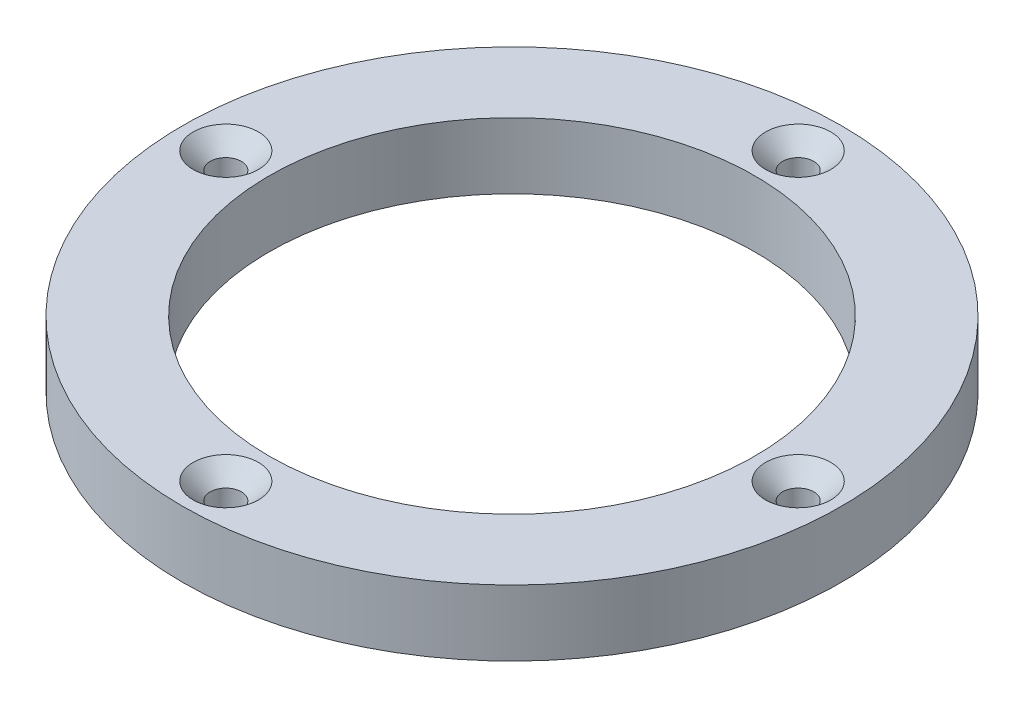
ISO-10303-21;
HEADER;
FILE_DESCRIPTION(('STEP AP214'),'2;1');
FILE_NAME('part.step','',(''),(''),'','','');
FILE_SCHEMA(('AUTOMOTIVE_DESIGN { 1 0 10303 214 1 1 1 1 }'));
ENDSEC;
DATA;
#1=APPLICATION_CONTEXT('core data for automotive mechanical design processes');
#2=APPLICATION_PROTOCOL_DEFINITION('international standard','automotive_design',2000,#1);
#3=PRODUCT_CONTEXT('',#1,'mechanical');
#4=PRODUCT('Part','Part','',(#3));
#5=PRODUCT_RELATED_PRODUCT_CATEGORY('part','',(#4));
#6=PRODUCT_DEFINITION_FORMATION('','',#4);
#7=PRODUCT_DEFINITION_CONTEXT('part definition',#1,'design');
#8=PRODUCT_DEFINITION('design','',#6,#7);
#9=PRODUCT_DEFINITION_SHAPE('','',#8);
#10=(LENGTH_UNIT() NAMED_UNIT(*) SI_UNIT(.MILLI.,.METRE.));
#11=(NAMED_UNIT(*) PLANE_ANGLE_UNIT() SI_UNIT($,.RADIAN.));
#12=(NAMED_UNIT(*) SI_UNIT($,.STERADIAN.) SOLID_ANGLE_UNIT());
#13=UNCERTAINTY_MEASURE_WITH_UNIT(LENGTH_MEASURE(1.E-05),#10,'distance_accuracy_value','');
#14=(GEOMETRIC_REPRESENTATION_CONTEXT(3) GLOBAL_UNCERTAINTY_ASSIGNED_CONTEXT((#13)) GLOBAL_UNIT_ASSIGNED_CONTEXT((#10,
#11,#12)) REPRESENTATION_CONTEXT('',''));
#15=CARTESIAN_POINT('',(0.,0.,0.));
#16=DIRECTION('',(0.,0.,1.));
#17=DIRECTION('',(1.,0.,0.));
#18=AXIS2_PLACEMENT_3D('',#15,#16,#17);
#19=CARTESIAN_POINT('',(0.,9.5,0.));
#20=DIRECTION('',(0.,1.,0.));
#21=DIRECTION('',(0.,0.,1.));
#22=AXIS2_PLACEMENT_3D('',#19,#20,#21);
#23=PLANE('',#22);
#24=CARTESIAN_POINT('',(0.,9.5,41.25));
#25=DIRECTION('',(0.,1.,0.));
#26=DIRECTION('',(0.,0.,1.));
#27=AXIS2_PLACEMENT_3D('',#24,#25,#26);
#28=CIRCLE('',#27,4.7);
#29=CARTESIAN_POINT('',(0.,9.5,45.95));
#30=VERTEX_POINT('',#29);
#31=EDGE_CURVE('E117',#30,#30,#28,.T.);
#32=ORIENTED_EDGE('',*,*,#31,.F.);
#33=EDGE_LOOP('',(#32));
#34=FACE_BOUND('',#33,.T.);
#35=CARTESIAN_POINT('',(41.25,9.5,0.));
#36=DIRECTION('',(0.,1.,0.));
#37=DIRECTION('',(0.,0.,1.));
#38=AXIS2_PLACEMENT_3D('',#35,#36,#37);
#39=CIRCLE('',#38,4.7);
#40=CARTESIAN_POINT('',(41.25,9.5,4.7));
#41=VERTEX_POINT('',#40);
#42=EDGE_CURVE('E109',#41,#41,#39,.T.);
#43=ORIENTED_EDGE('',*,*,#42,.F.);
#44=EDGE_LOOP('',(#43));
#45=FACE_BOUND('',#44,.T.);
#46=CARTESIAN_POINT('',(0.,9.5,-41.25));
#47=DIRECTION('',(0.,1.,0.));
#48=DIRECTION('',(0.,0.,1.));
#49=AXIS2_PLACEMENT_3D('',#46,#47,#48);
#50=CIRCLE('',#49,4.7);
#51=CARTESIAN_POINT('',(0.,9.5,-36.55));
#52=VERTEX_POINT('',#51);
#53=EDGE_CURVE('E101',#52,#52,#50,.T.);
#54=ORIENTED_EDGE('',*,*,#53,.F.);
#55=EDGE_LOOP('',(#54));
#56=FACE_BOUND('',#55,.T.);
#57=CARTESIAN_POINT('',(-41.25,9.5,0.));
#58=DIRECTION('',(0.,1.,0.));
#59=DIRECTION('',(0.,0.,1.));
#60=AXIS2_PLACEMENT_3D('',#57,#58,#59);
#61=CIRCLE('',#60,4.7);
#62=CARTESIAN_POINT('',(-41.25,9.5,4.7));
#63=VERTEX_POINT('',#62);
#64=EDGE_CURVE('E93',#63,#63,#61,.T.);
#65=ORIENTED_EDGE('',*,*,#64,.F.);
#66=EDGE_LOOP('',(#65));
#67=FACE_BOUND('',#66,.T.);
#68=CARTESIAN_POINT('',(0.,9.5,0.));
#69=DIRECTION('',(0.,1.,0.));
#70=DIRECTION('',(0.,0.,1.));
#71=AXIS2_PLACEMENT_3D('',#68,#69,#70);
#72=CIRCLE('',#71,47.5);
#73=CARTESIAN_POINT('',(0.,9.5,47.5));
#74=VERTEX_POINT('',#73);
#75=EDGE_CURVE('E10',#74,#74,#72,.T.);
#76=ORIENTED_EDGE('',*,*,#75,.T.);
#77=EDGE_LOOP('',(#76));
#78=FACE_BOUND('',#77,.T.);
#79=CARTESIAN_POINT('',(0.,9.5,0.));
#80=DIRECTION('',(0.,1.,0.));
#81=DIRECTION('',(0.,0.,1.));
#82=AXIS2_PLACEMENT_3D('',#79,#80,#81);
#83=CIRCLE('',#82,35.);
#84=CARTESIAN_POINT('',(0.,9.5,35.));
#85=VERTEX_POINT('',#84);
#86=EDGE_CURVE('E58',#85,#85,#83,.T.);
#87=ORIENTED_EDGE('',*,*,#86,.F.);
#88=EDGE_LOOP('',(#87));
#89=FACE_BOUND('',#88,.T.);
#90=ADVANCED_FACE('F43',(#34,#45,#56,#67,#78,#89),#23,.T.);
#91=CARTESIAN_POINT('',(0.,0.,0.));
#92=DIRECTION('',(0.,1.,0.));
#93=DIRECTION('',(0.,0.,1.));
#94=AXIS2_PLACEMENT_3D('',#91,#92,#93);
#95=PLANE('',#94);
#96=CARTESIAN_POINT('',(0.,0.,-41.25));
#97=DIRECTION('',(0.,1.,0.));
#98=DIRECTION('',(0.,0.,1.));
#99=AXIS2_PLACEMENT_3D('',#96,#97,#98);
#100=CIRCLE('',#99,2.25);
#101=CARTESIAN_POINT('',(0.,0.,-39.));
#102=VERTEX_POINT('',#101);
#103=EDGE_CURVE('E47',#102,#102,#100,.T.);
#104=ORIENTED_EDGE('',*,*,#103,.T.);
#105=EDGE_LOOP('',(#104));
#106=FACE_BOUND('',#105,.T.);
#107=CARTESIAN_POINT('',(41.25,0.,0.));
#108=DIRECTION('',(0.,1.,0.));
#109=DIRECTION('',(0.,0.,1.));
#110=AXIS2_PLACEMENT_3D('',#107,#108,#109);
#111=CIRCLE('',#110,2.25);
#112=CARTESIAN_POINT('',(41.25,0.,2.25));
#113=VERTEX_POINT('',#112);
#114=EDGE_CURVE('E72',#113,#113,#111,.T.);
#115=ORIENTED_EDGE('',*,*,#114,.T.);
#116=EDGE_LOOP('',(#115));
#117=FACE_BOUND('',#116,.T.);
#118=CARTESIAN_POINT('',(0.,0.,41.25));
#119=DIRECTION('',(0.,1.,0.));
#120=DIRECTION('',(0.,0.,1.));
#121=AXIS2_PLACEMENT_3D('',#118,#119,#120);
#122=CIRCLE('',#121,2.25);
#123=CARTESIAN_POINT('',(0.,0.,43.5));
#124=VERTEX_POINT('',#123);
#125=EDGE_CURVE('E68',#124,#124,#122,.T.);
#126=ORIENTED_EDGE('',*,*,#125,.T.);
#127=EDGE_LOOP('',(#126));
#128=FACE_BOUND('',#127,.T.);
#129=CARTESIAN_POINT('',(-41.25,0.,0.));
#130=DIRECTION('',(0.,1.,0.));
#131=DIRECTION('',(0.,0.,1.));
#132=AXIS2_PLACEMENT_3D('',#129,#130,#131);
#133=CIRCLE('',#132,2.25);
#134=CARTESIAN_POINT('',(-41.25,0.,2.25));
#135=VERTEX_POINT('',#134);
#136=EDGE_CURVE('E64',#135,#135,#133,.T.);
#137=ORIENTED_EDGE('',*,*,#136,.T.);
#138=EDGE_LOOP('',(#137));
#139=FACE_BOUND('',#138,.T.);
#140=CARTESIAN_POINT('',(0.,0.,0.));
#141=DIRECTION('',(0.,1.,0.));
#142=DIRECTION('',(0.,0.,1.));
#143=AXIS2_PLACEMENT_3D('',#140,#141,#142);
#144=CIRCLE('',#143,47.5);
#145=CARTESIAN_POINT('',(0.,0.,47.5));
#146=VERTEX_POINT('',#145);
#147=EDGE_CURVE('E52',#146,#146,#144,.T.);
#148=ORIENTED_EDGE('',*,*,#147,.F.);
#149=EDGE_LOOP('',(#148));
#150=FACE_BOUND('',#149,.T.);
#151=CARTESIAN_POINT('',(0.,0.,0.));
#152=DIRECTION('',(0.,1.,0.));
#153=DIRECTION('',(0.,0.,1.));
#154=AXIS2_PLACEMENT_3D('',#151,#152,#153);
#155=CIRCLE('',#154,35.);
#156=CARTESIAN_POINT('',(0.,0.,35.));
#157=VERTEX_POINT('',#156);
#158=EDGE_CURVE('E61',#157,#157,#155,.T.);
#159=ORIENTED_EDGE('',*,*,#158,.T.);
#160=EDGE_LOOP('',(#159));
#161=FACE_BOUND('',#160,.T.);
#162=ADVANCED_FACE('F126',(#106,#117,#128,#139,#150,#161),#95,.F.);
#163=CARTESIAN_POINT('',(0.,9.5,0.));
#164=DIRECTION('',(0.,-1.,0.));
#165=DIRECTION('',(0.,0.,-1.));
#166=AXIS2_PLACEMENT_3D('',#163,#164,#165);
#167=CYLINDRICAL_SURFACE('',#166,47.5);
#168=ORIENTED_EDGE('',*,*,#75,.F.);
#169=EDGE_LOOP('',(#168));
#170=FACE_BOUND('',#169,.T.);
#171=ORIENTED_EDGE('',*,*,#147,.T.);
#172=EDGE_LOOP('',(#171));
#173=FACE_BOUND('',#172,.T.);
#174=ADVANCED_FACE('F45',(#170,#173),#167,.T.);
#175=CARTESIAN_POINT('',(0.,9.5,0.));
#176=DIRECTION('',(0.,-1.,0.));
#177=DIRECTION('',(0.,0.,-1.));
#178=AXIS2_PLACEMENT_3D('',#175,#176,#177);
#179=CYLINDRICAL_SURFACE('',#178,35.);
#180=ORIENTED_EDGE('',*,*,#86,.T.);
#181=EDGE_LOOP('',(#180));
#182=FACE_BOUND('',#181,.T.);
#183=ORIENTED_EDGE('',*,*,#158,.F.);
#184=EDGE_LOOP('',(#183));
#185=FACE_BOUND('',#184,.T.);
#186=ADVANCED_FACE('F164',(#182,#185),#179,.F.);
#187=CARTESIAN_POINT('',(-41.25,-0.5,0.));
#188=DIRECTION('',(0.,1.,0.));
#189=DIRECTION('',(0.,0.,1.));
#190=AXIS2_PLACEMENT_3D('',#187,#188,#189);
#191=CYLINDRICAL_SURFACE('',#190,2.25);
#192=CARTESIAN_POINT('',(-41.25,7.04999999999999,0.));
#193=DIRECTION('',(0.,1.,0.));
#194=DIRECTION('',(0.,0.,1.));
#195=AXIS2_PLACEMENT_3D('',#192,#193,#194);
#196=CIRCLE('',#195,2.24999999999999);
#197=CARTESIAN_POINT('',(-41.25,7.04999999999999,2.24999999999999));
#198=VERTEX_POINT('',#197);
#199=EDGE_CURVE('E69',#198,#198,#196,.T.);
#200=ORIENTED_EDGE('',*,*,#199,.T.);
#201=EDGE_LOOP('',(#200));
#202=FACE_BOUND('',#201,.T.);
#203=ORIENTED_EDGE('',*,*,#136,.F.);
#204=EDGE_LOOP('',(#203));
#205=FACE_BOUND('',#204,.T.);
#206=ADVANCED_FACE('F160',(#202,#205),#191,.F.);
#207=CARTESIAN_POINT('',(0.,-0.5,41.25));
#208=DIRECTION('',(0.,1.,0.));
#209=DIRECTION('',(0.,0.,1.));
#210=AXIS2_PLACEMENT_3D('',#207,#208,#209);
#211=CYLINDRICAL_SURFACE('',#210,2.25);
#212=CARTESIAN_POINT('',(0.,7.04999999999999,41.25));
#213=DIRECTION('',(0.,1.,0.));
#214=DIRECTION('',(0.,0.,1.));
#215=AXIS2_PLACEMENT_3D('',#212,#213,#214);
#216=CIRCLE('',#215,2.24999999999999);
#217=CARTESIAN_POINT('',(0.,7.04999999999999,43.5));
#218=VERTEX_POINT('',#217);
#219=EDGE_CURVE('E113',#218,#218,#216,.T.);
#220=ORIENTED_EDGE('',*,*,#219,.T.);
#221=EDGE_LOOP('',(#220));
#222=FACE_BOUND('',#221,.T.);
#223=ORIENTED_EDGE('',*,*,#125,.F.);
#224=EDGE_LOOP('',(#223));
#225=FACE_BOUND('',#224,.T.);
#226=ADVANCED_FACE('F156',(#222,#225),#211,.F.);
#227=CARTESIAN_POINT('',(41.25,-0.5,0.));
#228=DIRECTION('',(0.,1.,0.));
#229=DIRECTION('',(0.,0.,1.));
#230=AXIS2_PLACEMENT_3D('',#227,#228,#229);
#231=CYLINDRICAL_SURFACE('',#230,2.25);
#232=CARTESIAN_POINT('',(41.25,7.04999999999999,0.));
#233=DIRECTION('',(0.,1.,0.));
#234=DIRECTION('',(0.,0.,1.));
#235=AXIS2_PLACEMENT_3D('',#232,#233,#234);
#236=CIRCLE('',#235,2.24999999999999);
#237=CARTESIAN_POINT('',(41.25,7.04999999999999,2.24999999999999));
#238=VERTEX_POINT('',#237);
#239=EDGE_CURVE('E105',#238,#238,#236,.T.);
#240=ORIENTED_EDGE('',*,*,#239,.T.);
#241=EDGE_LOOP('',(#240));
#242=FACE_BOUND('',#241,.T.);
#243=ORIENTED_EDGE('',*,*,#114,.F.);
#244=EDGE_LOOP('',(#243));
#245=FACE_BOUND('',#244,.T.);
#246=ADVANCED_FACE('F148',(#242,#245),#231,.F.);
#247=CARTESIAN_POINT('',(0.,-0.5,-41.25));
#248=DIRECTION('',(0.,1.,0.));
#249=DIRECTION('',(0.,0.,1.));
#250=AXIS2_PLACEMENT_3D('',#247,#248,#249);
#251=CYLINDRICAL_SURFACE('',#250,2.25);
#252=CARTESIAN_POINT('',(0.,7.04999999999999,-41.25));
#253=DIRECTION('',(0.,1.,0.));
#254=DIRECTION('',(0.,0.,1.));
#255=AXIS2_PLACEMENT_3D('',#252,#253,#254);
#256=CIRCLE('',#255,2.24999999999999);
#257=CARTESIAN_POINT('',(0.,7.04999999999999,-39.));
#258=VERTEX_POINT('',#257);
#259=EDGE_CURVE('E97',#258,#258,#256,.T.);
#260=ORIENTED_EDGE('',*,*,#259,.T.);
#261=EDGE_LOOP('',(#260));
#262=FACE_BOUND('',#261,.T.);
#263=ORIENTED_EDGE('',*,*,#103,.F.);
#264=EDGE_LOOP('',(#263));
#265=FACE_BOUND('',#264,.T.);
#266=ADVANCED_FACE('F138',(#262,#265),#251,.F.);
#267=CARTESIAN_POINT('',(-41.25,9.5,0.));
#268=DIRECTION('',(0.,1.,0.));
#269=DIRECTION('',(0.,0.,1.));
#270=AXIS2_PLACEMENT_3D('',#267,#268,#269);
#271=CONICAL_SURFACE('',#270,4.7,0.785398163397448);
#272=ORIENTED_EDGE('',*,*,#199,.F.);
#273=EDGE_LOOP('',(#272));
#274=FACE_BOUND('',#273,.T.);
#275=ORIENTED_EDGE('',*,*,#64,.T.);
#276=EDGE_LOOP('',(#275));
#277=FACE_BOUND('',#276,.T.);
#278=ADVANCED_FACE('F135',(#274,#277),#271,.F.);
#279=CARTESIAN_POINT('',(0.,9.5,-41.25));
#280=DIRECTION('',(0.,1.,0.));
#281=DIRECTION('',(0.,0.,1.));
#282=AXIS2_PLACEMENT_3D('',#279,#280,#281);
#283=CONICAL_SURFACE('',#282,4.7,0.785398163397449);
#284=ORIENTED_EDGE('',*,*,#259,.F.);
#285=EDGE_LOOP('',(#284));
#286=FACE_BOUND('',#285,.T.);
#287=ORIENTED_EDGE('',*,*,#53,.T.);
#288=EDGE_LOOP('',(#287));
#289=FACE_BOUND('',#288,.T.);
#290=ADVANCED_FACE('F137',(#286,#289),#283,.F.);
#291=CARTESIAN_POINT('',(41.25,9.5,0.));
#292=DIRECTION('',(0.,1.,0.));
#293=DIRECTION('',(0.,0.,1.));
#294=AXIS2_PLACEMENT_3D('',#291,#292,#293);
#295=CONICAL_SURFACE('',#294,4.7,0.785398163397448);
#296=ORIENTED_EDGE('',*,*,#239,.F.);
#297=EDGE_LOOP('',(#296));
#298=FACE_BOUND('',#297,.T.);
#299=ORIENTED_EDGE('',*,*,#42,.T.);
#300=EDGE_LOOP('',(#299));
#301=FACE_BOUND('',#300,.T.);
#302=ADVANCED_FACE('F145',(#298,#301),#295,.F.);
#303=CARTESIAN_POINT('',(0.,9.5,41.25));
#304=DIRECTION('',(0.,1.,0.));
#305=DIRECTION('',(0.,0.,1.));
#306=AXIS2_PLACEMENT_3D('',#303,#304,#305);
#307=CONICAL_SURFACE('',#306,4.7,0.785398163397449);
#308=ORIENTED_EDGE('',*,*,#219,.F.);
#309=EDGE_LOOP('',(#308));
#310=FACE_BOUND('',#309,.T.);
#311=ORIENTED_EDGE('',*,*,#31,.T.);
#312=EDGE_LOOP('',(#311));
#313=FACE_BOUND('',#312,.T.);
#314=ADVANCED_FACE('F122',(#310,#313),#307,.F.);
#315=CLOSED_SHELL('',(#90,#162,#174,#186,#206,#226,#246,#266,#278,#290,#302,#314));
#316=MANIFOLD_SOLID_BREP('B2',#315);
#317=ADVANCED_BREP_SHAPE_REPRESENTATION('',(#18,#316),#14);
#318=SHAPE_DEFINITION_REPRESENTATION(#9,#317);
ENDSEC;
END-ISO-10303-21;
